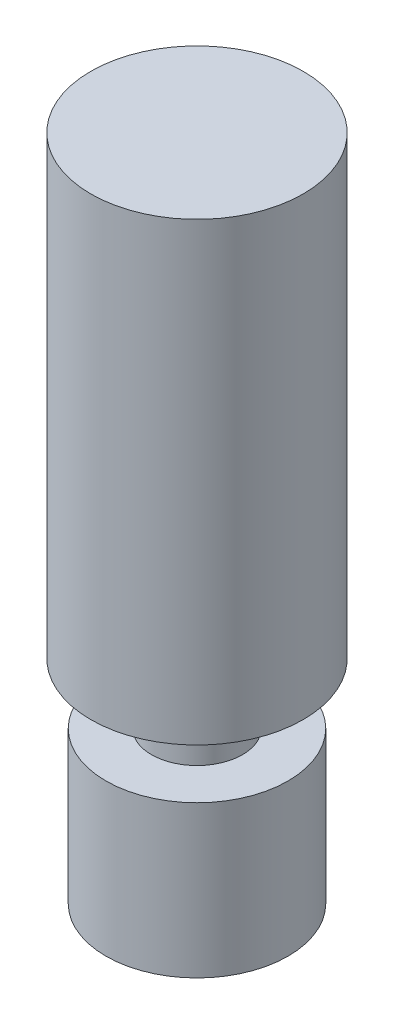
ISO-10303-21;
HEADER;
FILE_DESCRIPTION(('STEP AP214'),'2;1');
FILE_NAME('part.step','',(''),(''),'','','');
FILE_SCHEMA(('AUTOMOTIVE_DESIGN { 1 0 10303 214 1 1 1 1 }'));
ENDSEC;
DATA;
#1=APPLICATION_CONTEXT('core data for automotive mechanical design processes');
#2=APPLICATION_PROTOCOL_DEFINITION('international standard','automotive_design',2000,#1);
#3=PRODUCT_CONTEXT('',#1,'mechanical');
#4=PRODUCT('Part','Part','',(#3));
#5=PRODUCT_RELATED_PRODUCT_CATEGORY('part','',(#4));
#6=PRODUCT_DEFINITION_FORMATION('','',#4);
#7=PRODUCT_DEFINITION_CONTEXT('part definition',#1,'design');
#8=PRODUCT_DEFINITION('design','',#6,#7);
#9=PRODUCT_DEFINITION_SHAPE('','',#8);
#10=(LENGTH_UNIT() NAMED_UNIT(*) SI_UNIT(.MILLI.,.METRE.));
#11=(NAMED_UNIT(*) PLANE_ANGLE_UNIT() SI_UNIT($,.RADIAN.));
#12=(NAMED_UNIT(*) SI_UNIT($,.STERADIAN.) SOLID_ANGLE_UNIT());
#13=UNCERTAINTY_MEASURE_WITH_UNIT(LENGTH_MEASURE(1.E-05),#10,'distance_accuracy_value','');
#14=(GEOMETRIC_REPRESENTATION_CONTEXT(3) GLOBAL_UNCERTAINTY_ASSIGNED_CONTEXT((#13)) GLOBAL_UNIT_ASSIGNED_CONTEXT((#10,
#11,#12)) REPRESENTATION_CONTEXT('',''));
#15=CARTESIAN_POINT('',(0.,0.,0.));
#16=DIRECTION('',(0.,0.,1.));
#17=DIRECTION('',(1.,0.,0.));
#18=AXIS2_PLACEMENT_3D('',#15,#16,#17);
#19=CARTESIAN_POINT('',(0.,22.,0.));
#20=DIRECTION('',(0.,1.,0.));
#21=DIRECTION('',(0.,0.,1.));
#22=AXIS2_PLACEMENT_3D('',#19,#20,#21);
#23=PLANE('',#22);
#24=CARTESIAN_POINT('',(0.,22.,0.));
#25=DIRECTION('',(0.,-1.,0.));
#26=DIRECTION('',(0.,0.,-1.));
#27=AXIS2_PLACEMENT_3D('',#24,#25,#26);
#28=CIRCLE('',#27,3.5);
#29=CARTESIAN_POINT('',(0.,22.,-3.5));
#30=VERTEX_POINT('',#29);
#31=EDGE_CURVE('E10',#30,#30,#28,.T.);
#32=ORIENTED_EDGE('',*,*,#31,.F.);
#33=EDGE_LOOP('',(#32));
#34=FACE_BOUND('',#33,.T.);
#35=ADVANCED_FACE('F31',(#34),#23,.T.);
#36=CARTESIAN_POINT('',(0.,0.,0.));
#37=DIRECTION('',(0.,-1.,0.));
#38=DIRECTION('',(0.,0.,-1.));
#39=AXIS2_PLACEMENT_3D('',#36,#37,#38);
#40=CYLINDRICAL_SURFACE('',#39,3.5);
#41=ORIENTED_EDGE('',*,*,#31,.T.);
#42=EDGE_LOOP('',(#41));
#43=FACE_BOUND('',#42,.T.);
#44=CARTESIAN_POINT('',(0.,7.,0.));
#45=DIRECTION('',(0.,-1.,0.));
#46=DIRECTION('',(0.,0.,-1.));
#47=AXIS2_PLACEMENT_3D('',#44,#45,#46);
#48=CIRCLE('',#47,3.5);
#49=CARTESIAN_POINT('',(0.,7.,-3.5));
#50=VERTEX_POINT('',#49);
#51=EDGE_CURVE('E37',#50,#50,#48,.T.);
#52=ORIENTED_EDGE('',*,*,#51,.F.);
#53=EDGE_LOOP('',(#52));
#54=FACE_BOUND('',#53,.T.);
#55=ADVANCED_FACE('F73',(#43,#54),#40,.T.);
#56=CARTESIAN_POINT('',(3.5,7.,0.));
#57=DIRECTION('',(0.,-1.,0.));
#58=DIRECTION('',(0.,0.,-1.));
#59=AXIS2_PLACEMENT_3D('',#56,#57,#58);
#60=PLANE('',#59);
#61=ORIENTED_EDGE('',*,*,#51,.T.);
#62=EDGE_LOOP('',(#61));
#63=FACE_BOUND('',#62,.T.);
#64=CARTESIAN_POINT('',(0.,7.,0.));
#65=DIRECTION('',(0.,-1.,0.));
#66=DIRECTION('',(0.,0.,-1.));
#67=AXIS2_PLACEMENT_3D('',#64,#65,#66);
#68=CIRCLE('',#67,1.5);
#69=CARTESIAN_POINT('',(0.,7.,-1.5));
#70=VERTEX_POINT('',#69);
#71=EDGE_CURVE('E41',#70,#70,#68,.T.);
#72=ORIENTED_EDGE('',*,*,#71,.F.);
#73=EDGE_LOOP('',(#72));
#74=FACE_BOUND('',#73,.T.);
#75=ADVANCED_FACE('F78',(#63,#74),#60,.T.);
#76=CARTESIAN_POINT('',(0.,0.,0.));
#77=DIRECTION('',(0.,-1.,0.));
#78=DIRECTION('',(0.,0.,-1.));
#79=AXIS2_PLACEMENT_3D('',#76,#77,#78);
#80=CYLINDRICAL_SURFACE('',#79,1.5);
#81=ORIENTED_EDGE('',*,*,#71,.T.);
#82=EDGE_LOOP('',(#81));
#83=FACE_BOUND('',#82,.T.);
#84=CARTESIAN_POINT('',(0.,5.,0.));
#85=DIRECTION('',(0.,-1.,0.));
#86=DIRECTION('',(0.,0.,-1.));
#87=AXIS2_PLACEMENT_3D('',#84,#85,#86);
#88=CIRCLE('',#87,1.5);
#89=CARTESIAN_POINT('',(0.,5.,-1.5));
#90=VERTEX_POINT('',#89);
#91=EDGE_CURVE('E45',#90,#90,#88,.T.);
#92=ORIENTED_EDGE('',*,*,#91,.F.);
#93=EDGE_LOOP('',(#92));
#94=FACE_BOUND('',#93,.T.);
#95=ADVANCED_FACE('F69',(#83,#94),#80,.T.);
#96=CARTESIAN_POINT('',(1.5,5.,0.));
#97=DIRECTION('',(0.,1.,0.));
#98=DIRECTION('',(0.,0.,1.));
#99=AXIS2_PLACEMENT_3D('',#96,#97,#98);
#100=PLANE('',#99);
#101=ORIENTED_EDGE('',*,*,#91,.T.);
#102=EDGE_LOOP('',(#101));
#103=FACE_BOUND('',#102,.T.);
#104=CARTESIAN_POINT('',(0.,5.,0.));
#105=DIRECTION('',(0.,-1.,0.));
#106=DIRECTION('',(0.,0.,-1.));
#107=AXIS2_PLACEMENT_3D('',#104,#105,#106);
#108=CIRCLE('',#107,3.);
#109=CARTESIAN_POINT('',(0.,5.,-3.));
#110=VERTEX_POINT('',#109);
#111=EDGE_CURVE('E50',#110,#110,#108,.T.);
#112=ORIENTED_EDGE('',*,*,#111,.F.);
#113=EDGE_LOOP('',(#112));
#114=FACE_BOUND('',#113,.T.);
#115=ADVANCED_FACE('F61',(#103,#114),#100,.T.);
#116=CARTESIAN_POINT('',(0.,0.,0.));
#117=DIRECTION('',(0.,-1.,0.));
#118=DIRECTION('',(0.,0.,-1.));
#119=AXIS2_PLACEMENT_3D('',#116,#117,#118);
#120=CYLINDRICAL_SURFACE('',#119,3.);
#121=ORIENTED_EDGE('',*,*,#111,.T.);
#122=EDGE_LOOP('',(#121));
#123=FACE_BOUND('',#122,.T.);
#124=CARTESIAN_POINT('',(0.,0.,0.));
#125=DIRECTION('',(0.,-1.,0.));
#126=DIRECTION('',(0.,0.,-1.));
#127=AXIS2_PLACEMENT_3D('',#124,#125,#126);
#128=CIRCLE('',#127,3.);
#129=CARTESIAN_POINT('',(0.,0.,-3.));
#130=VERTEX_POINT('',#129);
#131=EDGE_CURVE('E53',#130,#130,#128,.T.);
#132=ORIENTED_EDGE('',*,*,#131,.F.);
#133=EDGE_LOOP('',(#132));
#134=FACE_BOUND('',#133,.T.);
#135=ADVANCED_FACE('F59',(#123,#134),#120,.T.);
#136=CARTESIAN_POINT('',(3.,0.,0.));
#137=DIRECTION('',(0.,-1.,0.));
#138=DIRECTION('',(0.,0.,-1.));
#139=AXIS2_PLACEMENT_3D('',#136,#137,#138);
#140=PLANE('',#139);
#141=ORIENTED_EDGE('',*,*,#131,.T.);
#142=EDGE_LOOP('',(#141));
#143=FACE_BOUND('',#142,.T.);
#144=ADVANCED_FACE('F57',(#143),#140,.T.);
#145=CLOSED_SHELL('',(#35,#55,#75,#95,#115,#135,#144));
#146=MANIFOLD_SOLID_BREP('B2',#145);
#147=ADVANCED_BREP_SHAPE_REPRESENTATION('',(#18,#146),#14);
#148=SHAPE_DEFINITION_REPRESENTATION(#9,#147);
ENDSEC;
END-ISO-10303-21;
